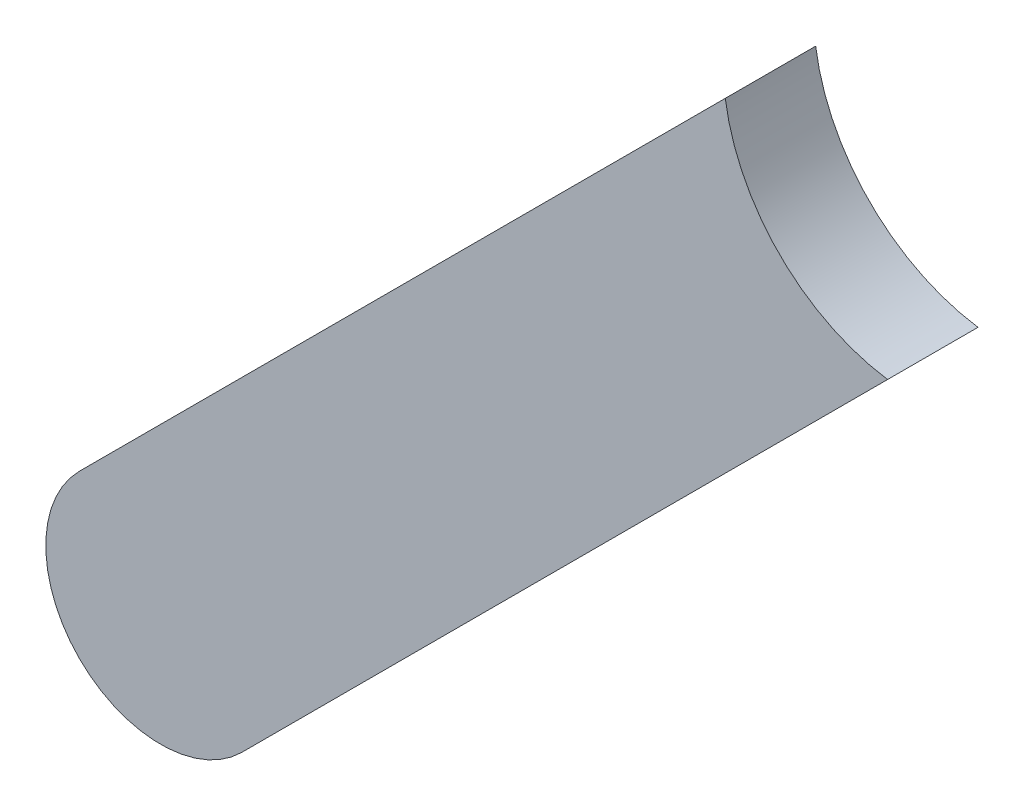
ISO-10303-21;
HEADER;
FILE_DESCRIPTION(('STEP AP214'),'2;1');
FILE_NAME('part.step','',(''),(''),'','','');
FILE_SCHEMA(('AUTOMOTIVE_DESIGN { 1 0 10303 214 1 1 1 1 }'));
ENDSEC;
DATA;
#1=APPLICATION_CONTEXT('core data for automotive mechanical design processes');
#2=APPLICATION_PROTOCOL_DEFINITION('international standard','automotive_design',2000,#1);
#3=PRODUCT_CONTEXT('',#1,'mechanical');
#4=PRODUCT('Part','Part','',(#3));
#5=PRODUCT_RELATED_PRODUCT_CATEGORY('part','',(#4));
#6=PRODUCT_DEFINITION_FORMATION('','',#4);
#7=PRODUCT_DEFINITION_CONTEXT('part definition',#1,'design');
#8=PRODUCT_DEFINITION('design','',#6,#7);
#9=PRODUCT_DEFINITION_SHAPE('','',#8);
#10=(LENGTH_UNIT() NAMED_UNIT(*) SI_UNIT(.MILLI.,.METRE.));
#11=(NAMED_UNIT(*) PLANE_ANGLE_UNIT() SI_UNIT($,.RADIAN.));
#12=(NAMED_UNIT(*) SI_UNIT($,.STERADIAN.) SOLID_ANGLE_UNIT());
#13=UNCERTAINTY_MEASURE_WITH_UNIT(LENGTH_MEASURE(1.E-05),#10,'distance_accuracy_value','');
#14=(GEOMETRIC_REPRESENTATION_CONTEXT(3) GLOBAL_UNCERTAINTY_ASSIGNED_CONTEXT((#13)) GLOBAL_UNIT_ASSIGNED_CONTEXT((#10,
#11,#12)) REPRESENTATION_CONTEXT('',''));
#15=CARTESIAN_POINT('',(0.,0.,0.));
#16=DIRECTION('',(0.,0.,1.));
#17=DIRECTION('',(1.,0.,0.));
#18=AXIS2_PLACEMENT_3D('',#15,#16,#17);
#19=CARTESIAN_POINT('',(135.5426042,63.93639486,0.));
#20=DIRECTION('',(-0.707106781186546,0.707106781186549,0.));
#21=DIRECTION('',(0.707106781186549,0.707106781186546,0.));
#22=AXIS2_PLACEMENT_3D('',#19,#20,#21);
#23=PLANE('',#22);
#24=DIRECTION('',(0.707106781186549,0.707106781186546,0.));
#25=VECTOR('',#24,1.);
#26=CARTESIAN_POINT('',(135.5426042,63.93639486,0.1999996));
#27=LINE('',#26,#25);
#28=CARTESIAN_POINT('',(135.5426042,63.93639486,0.1999996));
#29=VERTEX_POINT('',#28);
#30=CARTESIAN_POINT('',(136.971658947867,65.3654496078668,0.1999996));
#31=VERTEX_POINT('',#30);
#32=EDGE_CURVE('E11',#29,#31,#27,.T.);
#33=ORIENTED_EDGE('',*,*,#32,.F.);
#34=DIRECTION('',(0.,0.,1.));
#35=VECTOR('',#34,1.);
#36=CARTESIAN_POINT('',(135.5426042,63.93639486,0.));
#37=LINE('',#36,#35);
#38=CARTESIAN_POINT('',(135.5426042,63.93639486,0.));
#39=VERTEX_POINT('',#38);
#40=EDGE_CURVE('E24',#39,#29,#37,.T.);
#41=ORIENTED_EDGE('',*,*,#40,.F.);
#42=DIRECTION('',(0.707106781186549,0.707106781186546,0.));
#43=VECTOR('',#42,1.);
#44=CARTESIAN_POINT('',(135.5426042,63.93639486,0.));
#45=LINE('',#44,#43);
#46=CARTESIAN_POINT('',(136.971658947867,65.3654496078668,0.));
#47=VERTEX_POINT('',#46);
#48=EDGE_CURVE('E75',#39,#47,#45,.T.);
#49=ORIENTED_EDGE('',*,*,#48,.T.);
#50=DIRECTION('',(0.,0.,1.));
#51=VECTOR('',#50,1.);
#52=CARTESIAN_POINT('',(136.971658947867,65.3654496078668,0.));
#53=LINE('',#52,#51);
#54=EDGE_CURVE('E37',#47,#31,#53,.T.);
#55=ORIENTED_EDGE('',*,*,#54,.T.);
#56=EDGE_LOOP('',(#33,#41,#49,#55));
#57=FACE_BOUND('',#56,.T.);
#58=ADVANCED_FACE('F17',(#57),#23,.F.);
#59=CARTESIAN_POINT('',(137.033,65.786,0.));
#60=DIRECTION('',(0.,0.,-1.));
#61=DIRECTION('',(1.,0.,0.));
#62=AXIS2_PLACEMENT_3D('',#59,#60,#61);
#63=CYLINDRICAL_SURFACE('',#62,0.42500042);
#64=DIRECTION('',(0.,0.,1.));
#65=VECTOR('',#64,1.);
#66=CARTESIAN_POINT('',(136.612449607867,65.7246589478668,0.));
#67=LINE('',#66,#65);
#68=CARTESIAN_POINT('',(136.612449607867,65.7246589478668,0.));
#69=VERTEX_POINT('',#68);
#70=CARTESIAN_POINT('',(136.612449607867,65.7246589478668,0.1999996));
#71=VERTEX_POINT('',#70);
#72=EDGE_CURVE('E67',#69,#71,#67,.T.);
#73=ORIENTED_EDGE('',*,*,#72,.T.);
#74=CARTESIAN_POINT('',(137.033,65.786,0.1999996));
#75=DIRECTION('',(0.,0.,1.));
#76=DIRECTION('',(1.,0.,0.));
#77=AXIS2_PLACEMENT_3D('',#74,#75,#76);
#78=CIRCLE('',#77,0.42500042);
#79=EDGE_CURVE('E82',#71,#31,#78,.T.);
#80=ORIENTED_EDGE('',*,*,#79,.T.);
#81=ORIENTED_EDGE('',*,*,#54,.F.);
#82=CARTESIAN_POINT('',(137.033,65.786,0.));
#83=DIRECTION('',(0.,0.,1.));
#84=DIRECTION('',(1.,0.,0.));
#85=AXIS2_PLACEMENT_3D('',#82,#83,#84);
#86=CIRCLE('',#85,0.42500042);
#87=EDGE_CURVE('E80',#69,#47,#86,.T.);
#88=ORIENTED_EDGE('',*,*,#87,.F.);
#89=EDGE_LOOP('',(#73,#80,#81,#88));
#90=FACE_BOUND('',#89,.T.);
#91=ADVANCED_FACE('F88',(#90),#63,.F.);
#92=CARTESIAN_POINT('',(136.612449607867,65.7246589478668,0.));
#93=DIRECTION('',(0.707106781186548,-0.707106781186548,0.));
#94=DIRECTION('',(-0.707106781186548,-0.707106781186548,0.));
#95=AXIS2_PLACEMENT_3D('',#92,#93,#94);
#96=PLANE('',#95);
#97=DIRECTION('',(-0.707106781186548,-0.707106781186548,0.));
#98=VECTOR('',#97,1.);
#99=CARTESIAN_POINT('',(136.8533966,65.96560594,0.1999996));
#100=LINE('',#99,#98);
#101=CARTESIAN_POINT('',(135.18339486,64.2956042,0.1999996));
#102=VERTEX_POINT('',#101);
#103=EDGE_CURVE('E71',#71,#102,#100,.T.);
#104=ORIENTED_EDGE('',*,*,#103,.F.);
#105=ORIENTED_EDGE('',*,*,#72,.F.);
#106=DIRECTION('',(-0.707106781186548,-0.707106781186548,0.));
#107=VECTOR('',#106,1.);
#108=CARTESIAN_POINT('',(136.8533966,65.96560594,0.));
#109=LINE('',#108,#107);
#110=CARTESIAN_POINT('',(135.18339486,64.2956042,0.));
#111=VERTEX_POINT('',#110);
#112=EDGE_CURVE('E63',#69,#111,#109,.T.);
#113=ORIENTED_EDGE('',*,*,#112,.T.);
#114=DIRECTION('',(0.,0.,1.));
#115=VECTOR('',#114,1.);
#116=CARTESIAN_POINT('',(135.18339486,64.2956042,0.));
#117=LINE('',#116,#115);
#118=EDGE_CURVE('E53',#111,#102,#117,.T.);
#119=ORIENTED_EDGE('',*,*,#118,.T.);
#120=EDGE_LOOP('',(#104,#105,#113,#119));
#121=FACE_BOUND('',#120,.T.);
#122=ADVANCED_FACE('F66',(#121),#96,.F.);
#123=CARTESIAN_POINT('',(135.36299953,64.11599953,0.));
#124=DIRECTION('',(0.,0.,-1.));
#125=DIRECTION('',(-0.707106781186548,0.707106781186548,0.));
#126=AXIS2_PLACEMENT_3D('',#123,#124,#125);
#127=CYLINDRICAL_SURFACE('',#126,0.253999360179546);
#128=CARTESIAN_POINT('',(135.36299953,64.11599953,0.1999996));
#129=DIRECTION('',(0.,0.,1.));
#130=DIRECTION('',(-0.707106781186548,0.707106781186548,0.));
#131=AXIS2_PLACEMENT_3D('',#128,#129,#130);
#132=CIRCLE('',#131,0.253999360179546);
#133=EDGE_CURVE('E59',#102,#29,#132,.T.);
#134=ORIENTED_EDGE('',*,*,#133,.F.);
#135=ORIENTED_EDGE('',*,*,#118,.F.);
#136=CARTESIAN_POINT('',(135.36299953,64.11599953,0.));
#137=DIRECTION('',(0.,0.,1.));
#138=DIRECTION('',(-0.707106781186548,0.707106781186548,0.));
#139=AXIS2_PLACEMENT_3D('',#136,#137,#138);
#140=CIRCLE('',#139,0.253999360179546);
#141=EDGE_CURVE('E57',#111,#39,#140,.T.);
#142=ORIENTED_EDGE('',*,*,#141,.T.);
#143=ORIENTED_EDGE('',*,*,#40,.T.);
#144=EDGE_LOOP('',(#134,#135,#142,#143));
#145=FACE_BOUND('',#144,.T.);
#146=ADVANCED_FACE('F55',(#145),#127,.T.);
#147=CARTESIAN_POINT('',(135.5426042,63.93639486,0.));
#148=DIRECTION('',(0.,0.,-1.));
#149=DIRECTION('',(-1.,0.,0.));
#150=AXIS2_PLACEMENT_3D('',#147,#148,#149);
#151=PLANE('',#150);
#152=ORIENTED_EDGE('',*,*,#48,.F.);
#153=ORIENTED_EDGE('',*,*,#141,.F.);
#154=ORIENTED_EDGE('',*,*,#112,.F.);
#155=ORIENTED_EDGE('',*,*,#87,.T.);
#156=EDGE_LOOP('',(#152,#153,#154,#155));
#157=FACE_BOUND('',#156,.T.);
#158=ADVANCED_FACE('F74',(#157),#151,.T.);
#159=CARTESIAN_POINT('',(135.5426042,63.93639486,0.1999996));
#160=DIRECTION('',(0.,0.,-1.));
#161=DIRECTION('',(-1.,0.,0.));
#162=AXIS2_PLACEMENT_3D('',#159,#160,#161);
#163=PLANE('',#162);
#164=ORIENTED_EDGE('',*,*,#133,.T.);
#165=ORIENTED_EDGE('',*,*,#32,.T.);
#166=ORIENTED_EDGE('',*,*,#79,.F.);
#167=ORIENTED_EDGE('',*,*,#103,.T.);
#168=EDGE_LOOP('',(#164,#165,#166,#167));
#169=FACE_BOUND('',#168,.T.);
#170=ADVANCED_FACE('F91',(#169),#163,.F.);
#171=CLOSED_SHELL('',(#58,#91,#122,#146,#158,#170));
#172=MANIFOLD_SOLID_BREP('B1',#171);
#173=ADVANCED_BREP_SHAPE_REPRESENTATION('',(#18,#172),#14);
#174=SHAPE_DEFINITION_REPRESENTATION(#9,#173);
ENDSEC;
END-ISO-10303-21;
